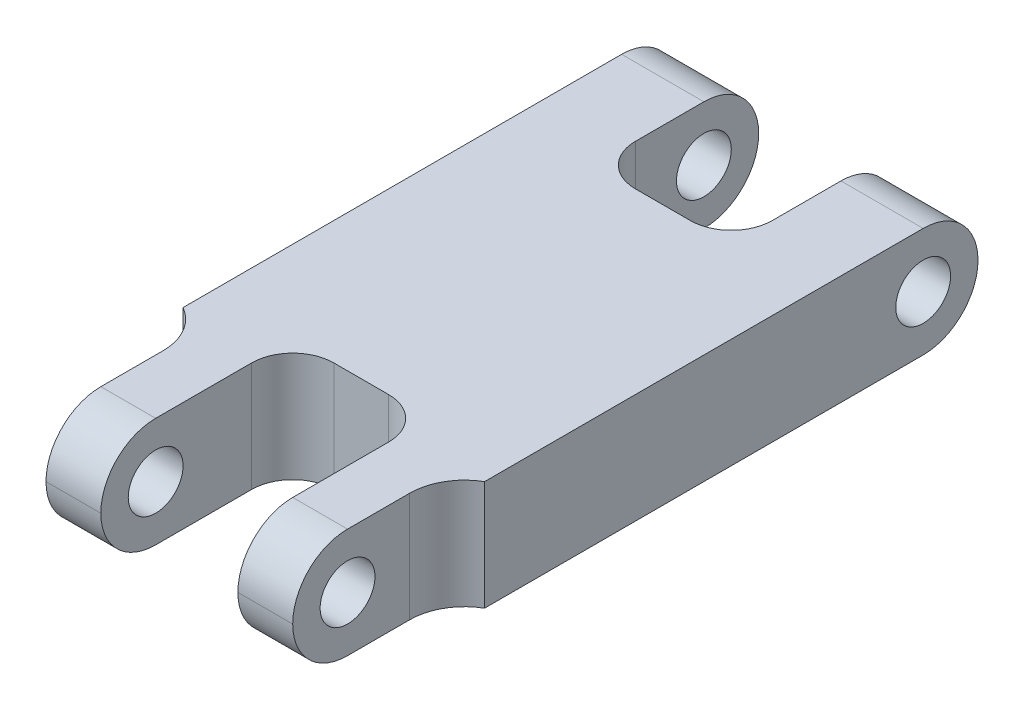
ISO-10303-21;
HEADER;
FILE_DESCRIPTION(('STEP AP214'),'2;1');
FILE_NAME('part.step','',(''),(''),'','','');
FILE_SCHEMA(('AUTOMOTIVE_DESIGN { 1 0 10303 214 1 1 1 1 }'));
ENDSEC;
DATA;
#1=APPLICATION_CONTEXT('core data for automotive mechanical design processes');
#2=APPLICATION_PROTOCOL_DEFINITION('international standard','automotive_design',2000,#1);
#3=PRODUCT_CONTEXT('',#1,'mechanical');
#4=PRODUCT('Part','Part','',(#3));
#5=PRODUCT_RELATED_PRODUCT_CATEGORY('part','',(#4));
#6=PRODUCT_DEFINITION_FORMATION('','',#4);
#7=PRODUCT_DEFINITION_CONTEXT('part definition',#1,'design');
#8=PRODUCT_DEFINITION('design','',#6,#7);
#9=PRODUCT_DEFINITION_SHAPE('','',#8);
#10=(LENGTH_UNIT() NAMED_UNIT(*) SI_UNIT(.MILLI.,.METRE.));
#11=(NAMED_UNIT(*) PLANE_ANGLE_UNIT() SI_UNIT($,.RADIAN.));
#12=(NAMED_UNIT(*) SI_UNIT($,.STERADIAN.) SOLID_ANGLE_UNIT());
#13=UNCERTAINTY_MEASURE_WITH_UNIT(LENGTH_MEASURE(1.E-05),#10,'distance_accuracy_value','');
#14=(GEOMETRIC_REPRESENTATION_CONTEXT(3) GLOBAL_UNCERTAINTY_ASSIGNED_CONTEXT((#13)) GLOBAL_UNIT_ASSIGNED_CONTEXT((#10,
#11,#12)) REPRESENTATION_CONTEXT('',''));
#15=CARTESIAN_POINT('',(0.,0.,0.));
#16=DIRECTION('',(0.,0.,1.));
#17=DIRECTION('',(1.,0.,0.));
#18=AXIS2_PLACEMENT_3D('',#15,#16,#17);
#19=CARTESIAN_POINT('',(-17.4625,6.35,76.2));
#20=DIRECTION('',(1.,0.,0.));
#21=DIRECTION('',(0.,1.,0.));
#22=AXIS2_PLACEMENT_3D('',#19,#20,#21);
#23=PLANE('',#22);
#24=CARTESIAN_POINT('',(-17.4625,0.,6.35));
#25=DIRECTION('',(1.,0.,0.));
#26=DIRECTION('',(0.,0.,-1.));
#27=AXIS2_PLACEMENT_3D('',#24,#25,#26);
#28=CIRCLE('',#27,3.175);
#29=CARTESIAN_POINT('',(-17.4625,0.,3.175));
#30=VERTEX_POINT('',#29);
#31=EDGE_CURVE('E249',#30,#30,#28,.T.);
#32=ORIENTED_EDGE('',*,*,#31,.T.);
#33=EDGE_LOOP('',(#32));
#34=FACE_BOUND('',#33,.T.);
#35=DIRECTION('',(0.,0.,-1.));
#36=VECTOR('',#35,1.);
#37=CARTESIAN_POINT('',(-17.4625,-6.35,76.2));
#38=LINE('',#37,#36);
#39=CARTESIAN_POINT('',(-17.4625,-6.35,57.15));
#40=VERTEX_POINT('',#39);
#41=CARTESIAN_POINT('',(-17.4625,-6.35,6.35000000000002));
#42=VERTEX_POINT('',#41);
#43=EDGE_CURVE('E201',#40,#42,#38,.T.);
#44=ORIENTED_EDGE('',*,*,#43,.F.);
#45=DIRECTION('',(0.,1.,0.));
#46=VECTOR('',#45,1.);
#47=CARTESIAN_POINT('',(-17.4625,-6.35,57.15));
#48=LINE('',#47,#46);
#49=CARTESIAN_POINT('',(-17.4625,6.35,57.15));
#50=VERTEX_POINT('',#49);
#51=EDGE_CURVE('E211',#40,#50,#48,.T.);
#52=ORIENTED_EDGE('',*,*,#51,.T.);
#53=DIRECTION('',(0.,0.,-1.));
#54=VECTOR('',#53,1.);
#55=CARTESIAN_POINT('',(-17.4625,6.35,76.2));
#56=LINE('',#55,#54);
#57=CARTESIAN_POINT('',(-17.4625,6.35,6.35000000000002));
#58=VERTEX_POINT('',#57);
#59=EDGE_CURVE('E286',#50,#58,#56,.T.);
#60=ORIENTED_EDGE('',*,*,#59,.T.);
#61=CARTESIAN_POINT('',(-17.4625,0.,6.34999999999999));
#62=DIRECTION('',(1.,0.,0.));
#63=DIRECTION('',(0.,1.,0.));
#64=AXIS2_PLACEMENT_3D('',#61,#62,#63);
#65=CIRCLE('',#64,6.35);
#66=CARTESIAN_POINT('',(-17.4625,0.,0.));
#67=VERTEX_POINT('',#66);
#68=EDGE_CURVE('E333',#58,#67,#65,.F.);
#69=ORIENTED_EDGE('',*,*,#68,.T.);
#70=CARTESIAN_POINT('',(-17.4625,0.,6.34999999999999));
#71=DIRECTION('',(1.,0.,0.));
#72=DIRECTION('',(0.,1.,0.));
#73=AXIS2_PLACEMENT_3D('',#70,#71,#72);
#74=CIRCLE('',#73,6.35);
#75=EDGE_CURVE('E214',#67,#42,#74,.F.);
#76=ORIENTED_EDGE('',*,*,#75,.T.);
#77=EDGE_LOOP('',(#44,#52,#60,#69,#76));
#78=FACE_BOUND('',#77,.T.);
#79=ADVANCED_FACE('F38',(#34,#78),#23,.F.);
#80=CARTESIAN_POINT('',(-17.4625,-6.35,76.2));
#81=DIRECTION('',(0.,1.,0.));
#82=DIRECTION('',(0.,0.,1.));
#83=AXIS2_PLACEMENT_3D('',#80,#81,#82);
#84=PLANE('',#83);
#85=DIRECTION('',(1.,0.,0.));
#86=VECTOR('',#85,1.);
#87=CARTESIAN_POINT('',(-17.4625,-6.35,69.85));
#88=LINE('',#87,#86);
#89=CARTESIAN_POINT('',(-7.9375,-6.35,69.85));
#90=VERTEX_POINT('',#89);
#91=CARTESIAN_POINT('',(-14.2875,-6.35,69.85));
#92=VERTEX_POINT('',#91);
#93=EDGE_CURVE('E307',#90,#92,#88,.F.);
#94=ORIENTED_EDGE('',*,*,#93,.T.);
#95=DIRECTION('',(0.,0.,-1.));
#96=VECTOR('',#95,1.);
#97=CARTESIAN_POINT('',(-14.2875,-6.35,57.15));
#98=LINE('',#97,#96);
#99=CARTESIAN_POINT('',(-14.2875,-6.35,62.6492613140312));
#100=VERTEX_POINT('',#99);
#101=EDGE_CURVE('E203',#92,#100,#98,.T.);
#102=ORIENTED_EDGE('',*,*,#101,.T.);
#103=CARTESIAN_POINT('',(-20.6375,-6.35,62.6492613140312));
#104=DIRECTION('',(0.,1.,0.));
#105=DIRECTION('',(0.,0.,1.));
#106=AXIS2_PLACEMENT_3D('',#103,#104,#105);
#107=CIRCLE('',#106,6.35);
#108=EDGE_CURVE('E197',#100,#40,#107,.T.);
#109=ORIENTED_EDGE('',*,*,#108,.T.);
#110=ORIENTED_EDGE('',*,*,#43,.T.);
#111=DIRECTION('',(1.,0.,0.));
#112=VECTOR('',#111,1.);
#113=CARTESIAN_POINT('',(-17.4625,-6.35,6.34999999999999));
#114=LINE('',#113,#112);
#115=CARTESIAN_POINT('',(-7.9375,-6.35,6.34999999999999));
#116=VERTEX_POINT('',#115);
#117=EDGE_CURVE('E302',#42,#116,#114,.T.);
#118=ORIENTED_EDGE('',*,*,#117,.T.);
#119=DIRECTION('',(0.,0.,1.));
#120=VECTOR('',#119,1.);
#121=CARTESIAN_POINT('',(-7.9375,-6.35,0.));
#122=LINE('',#121,#120);
#123=CARTESIAN_POINT('',(-7.9375,-6.35,14.2875));
#124=VERTEX_POINT('',#123);
#125=EDGE_CURVE('E259',#116,#124,#122,.T.);
#126=ORIENTED_EDGE('',*,*,#125,.T.);
#127=CARTESIAN_POINT('',(-3.175,-6.35,14.2875));
#128=DIRECTION('',(0.,1.,0.));
#129=DIRECTION('',(0.,0.,1.));
#130=AXIS2_PLACEMENT_3D('',#127,#128,#129);
#131=CIRCLE('',#130,4.7625);
#132=CARTESIAN_POINT('',(-3.175,-6.35,19.05));
#133=VERTEX_POINT('',#132);
#134=EDGE_CURVE('E369',#124,#133,#131,.T.);
#135=ORIENTED_EDGE('',*,*,#134,.T.);
#136=DIRECTION('',(1.,0.,0.));
#137=VECTOR('',#136,1.);
#138=CARTESIAN_POINT('',(-7.9375,-6.35,19.05));
#139=LINE('',#138,#137);
#140=CARTESIAN_POINT('',(3.175,-6.35,19.05));
#141=VERTEX_POINT('',#140);
#142=EDGE_CURVE('E262',#133,#141,#139,.T.);
#143=ORIENTED_EDGE('',*,*,#142,.T.);
#144=CARTESIAN_POINT('',(3.175,-6.35,14.2875));
#145=DIRECTION('',(0.,1.,0.));
#146=DIRECTION('',(0.,0.,1.));
#147=AXIS2_PLACEMENT_3D('',#144,#145,#146);
#148=CIRCLE('',#147,4.7625);
#149=CARTESIAN_POINT('',(7.9375,-6.35,14.2875));
#150=VERTEX_POINT('',#149);
#151=EDGE_CURVE('E373',#141,#150,#148,.T.);
#152=ORIENTED_EDGE('',*,*,#151,.T.);
#153=DIRECTION('',(0.,0.,-1.));
#154=VECTOR('',#153,1.);
#155=CARTESIAN_POINT('',(7.9375,-6.35,0.));
#156=LINE('',#155,#154);
#157=CARTESIAN_POINT('',(7.9375,-6.35,6.34999999999999));
#158=VERTEX_POINT('',#157);
#159=EDGE_CURVE('E266',#150,#158,#156,.T.);
#160=ORIENTED_EDGE('',*,*,#159,.T.);
#161=DIRECTION('',(1.,0.,0.));
#162=VECTOR('',#161,1.);
#163=CARTESIAN_POINT('',(-17.4625,-6.35,6.34999999999999));
#164=LINE('',#163,#162);
#165=CARTESIAN_POINT('',(17.4625,-6.35,6.35000000000002));
#166=VERTEX_POINT('',#165);
#167=EDGE_CURVE('E304',#158,#166,#164,.T.);
#168=ORIENTED_EDGE('',*,*,#167,.T.);
#169=DIRECTION('',(0.,0.,-1.));
#170=VECTOR('',#169,1.);
#171=CARTESIAN_POINT('',(17.4625,-6.35,76.2));
#172=LINE('',#171,#170);
#173=CARTESIAN_POINT('',(17.4625,-6.35,57.15));
#174=VERTEX_POINT('',#173);
#175=EDGE_CURVE('E217',#174,#166,#172,.T.);
#176=ORIENTED_EDGE('',*,*,#175,.F.);
#177=CARTESIAN_POINT('',(20.6375,-6.35,62.6492613140312));
#178=DIRECTION('',(0.,1.,0.));
#179=DIRECTION('',(0.,0.,1.));
#180=AXIS2_PLACEMENT_3D('',#177,#178,#179);
#181=CIRCLE('',#180,6.35);
#182=CARTESIAN_POINT('',(14.2875,-6.35,62.6492613140312));
#183=VERTEX_POINT('',#182);
#184=EDGE_CURVE('E11',#174,#183,#181,.T.);
#185=ORIENTED_EDGE('',*,*,#184,.T.);
#186=DIRECTION('',(0.,0.,1.));
#187=VECTOR('',#186,1.);
#188=CARTESIAN_POINT('',(14.2875,-6.35,57.15));
#189=LINE('',#188,#187);
#190=CARTESIAN_POINT('',(14.2875,-6.35,69.85));
#191=VERTEX_POINT('',#190);
#192=EDGE_CURVE('E233',#183,#191,#189,.T.);
#193=ORIENTED_EDGE('',*,*,#192,.T.);
#194=DIRECTION('',(1.,0.,0.));
#195=VECTOR('',#194,1.);
#196=CARTESIAN_POINT('',(7.9375,-6.35,69.85));
#197=LINE('',#196,#195);
#198=CARTESIAN_POINT('',(7.9375,-6.35,69.85));
#199=VERTEX_POINT('',#198);
#200=EDGE_CURVE('E309',#191,#199,#197,.F.);
#201=ORIENTED_EDGE('',*,*,#200,.T.);
#202=DIRECTION('',(0.,0.,-1.));
#203=VECTOR('',#202,1.);
#204=CARTESIAN_POINT('',(7.9375,-6.35,53.975));
#205=LINE('',#204,#203);
#206=CARTESIAN_POINT('',(7.9375,-6.35,58.7375));
#207=VERTEX_POINT('',#206);
#208=EDGE_CURVE('E279',#199,#207,#205,.T.);
#209=ORIENTED_EDGE('',*,*,#208,.T.);
#210=CARTESIAN_POINT('',(3.175,-6.35,58.7375));
#211=DIRECTION('',(0.,1.,0.));
#212=DIRECTION('',(0.,0.,1.));
#213=AXIS2_PLACEMENT_3D('',#210,#211,#212);
#214=CIRCLE('',#213,4.7625);
#215=CARTESIAN_POINT('',(3.175,-6.35,53.975));
#216=VERTEX_POINT('',#215);
#217=EDGE_CURVE('E387',#207,#216,#214,.T.);
#218=ORIENTED_EDGE('',*,*,#217,.T.);
#219=DIRECTION('',(-1.,0.,0.));
#220=VECTOR('',#219,1.);
#221=CARTESIAN_POINT('',(-7.9375,-6.35,53.975));
#222=LINE('',#221,#220);
#223=CARTESIAN_POINT('',(-3.175,-6.35,53.975));
#224=VERTEX_POINT('',#223);
#225=EDGE_CURVE('E283',#216,#224,#222,.T.);
#226=ORIENTED_EDGE('',*,*,#225,.T.);
#227=CARTESIAN_POINT('',(-3.175,-6.35,58.7375));
#228=DIRECTION('',(0.,1.,0.));
#229=DIRECTION('',(0.,0.,1.));
#230=AXIS2_PLACEMENT_3D('',#227,#228,#229);
#231=CIRCLE('',#230,4.7625);
#232=CARTESIAN_POINT('',(-7.9375,-6.35,58.7375));
#233=VERTEX_POINT('',#232);
#234=EDGE_CURVE('E391',#224,#233,#231,.T.);
#235=ORIENTED_EDGE('',*,*,#234,.T.);
#236=DIRECTION('',(0.,0.,1.));
#237=VECTOR('',#236,1.);
#238=CARTESIAN_POINT('',(-7.9375,-6.35,53.975));
#239=LINE('',#238,#237);
#240=EDGE_CURVE('E277',#233,#90,#239,.T.);
#241=ORIENTED_EDGE('',*,*,#240,.T.);
#242=EDGE_LOOP('',(#94,#102,#109,#110,#118,#126,#135,#143,#152,#160,#168,#176,#185,#193,#201,
#209,#218,#226,#235,#241));
#243=FACE_BOUND('',#242,.T.);
#244=ADVANCED_FACE('F200',(#243),#84,.F.);
#245=CARTESIAN_POINT('',(17.4625,6.35,76.2));
#246=DIRECTION('',(-1.,0.,0.));
#247=DIRECTION('',(0.,0.,1.));
#248=AXIS2_PLACEMENT_3D('',#245,#246,#247);
#249=PLANE('',#248);
#250=CARTESIAN_POINT('',(17.4625,0.,6.35));
#251=DIRECTION('',(1.,0.,0.));
#252=DIRECTION('',(0.,0.,-1.));
#253=AXIS2_PLACEMENT_3D('',#250,#251,#252);
#254=CIRCLE('',#253,3.175);
#255=CARTESIAN_POINT('',(17.4625,0.,3.175));
#256=VERTEX_POINT('',#255);
#257=EDGE_CURVE('E248',#256,#256,#254,.T.);
#258=ORIENTED_EDGE('',*,*,#257,.F.);
#259=EDGE_LOOP('',(#258));
#260=FACE_BOUND('',#259,.T.);
#261=DIRECTION('',(0.,0.,-1.));
#262=VECTOR('',#261,1.);
#263=CARTESIAN_POINT('',(17.4625,6.35,76.2));
#264=LINE('',#263,#262);
#265=CARTESIAN_POINT('',(17.4625,6.35,57.15));
#266=VERTEX_POINT('',#265);
#267=CARTESIAN_POINT('',(17.4625,6.35,6.35000000000002));
#268=VERTEX_POINT('',#267);
#269=EDGE_CURVE('E295',#266,#268,#264,.T.);
#270=ORIENTED_EDGE('',*,*,#269,.F.);
#271=DIRECTION('',(0.,1.,0.));
#272=VECTOR('',#271,1.);
#273=CARTESIAN_POINT('',(17.4625,-6.35,57.15));
#274=LINE('',#273,#272);
#275=EDGE_CURVE('E235',#174,#266,#274,.T.);
#276=ORIENTED_EDGE('',*,*,#275,.F.);
#277=ORIENTED_EDGE('',*,*,#175,.T.);
#278=CARTESIAN_POINT('',(17.4625,0.,6.34999999999999));
#279=DIRECTION('',(-1.,0.,0.));
#280=DIRECTION('',(0.,0.,1.));
#281=AXIS2_PLACEMENT_3D('',#278,#279,#280);
#282=CIRCLE('',#281,6.35);
#283=CARTESIAN_POINT('',(17.4625,0.,0.));
#284=VERTEX_POINT('',#283);
#285=EDGE_CURVE('E300',#166,#284,#282,.F.);
#286=ORIENTED_EDGE('',*,*,#285,.T.);
#287=CARTESIAN_POINT('',(17.4625,0.,6.34999999999999));
#288=DIRECTION('',(-1.,0.,0.));
#289=DIRECTION('',(0.,0.,1.));
#290=AXIS2_PLACEMENT_3D('',#287,#288,#289);
#291=CIRCLE('',#290,6.35);
#292=EDGE_CURVE('E216',#284,#268,#291,.F.);
#293=ORIENTED_EDGE('',*,*,#292,.T.);
#294=EDGE_LOOP('',(#270,#276,#277,#286,#293));
#295=FACE_BOUND('',#294,.T.);
#296=ADVANCED_FACE('F404',(#260,#295),#249,.F.);
#297=CARTESIAN_POINT('',(-17.4625,6.35,76.2));
#298=DIRECTION('',(0.,-1.,0.));
#299=DIRECTION('',(0.,0.,-1.));
#300=AXIS2_PLACEMENT_3D('',#297,#298,#299);
#301=PLANE('',#300);
#302=ORIENTED_EDGE('',*,*,#59,.F.);
#303=CARTESIAN_POINT('',(-20.6375,6.35,62.6492613140312));
#304=DIRECTION('',(0.,-1.,0.));
#305=DIRECTION('',(0.,0.,-1.));
#306=AXIS2_PLACEMENT_3D('',#303,#304,#305);
#307=CIRCLE('',#306,6.35);
#308=CARTESIAN_POINT('',(-14.2875,6.35,62.6492613140312));
#309=VERTEX_POINT('',#308);
#310=EDGE_CURVE('E207',#50,#309,#307,.T.);
#311=ORIENTED_EDGE('',*,*,#310,.T.);
#312=DIRECTION('',(0.,0.,-1.));
#313=VECTOR('',#312,1.);
#314=CARTESIAN_POINT('',(-14.2875,6.35,57.15));
#315=LINE('',#314,#313);
#316=CARTESIAN_POINT('',(-14.2875,6.35,69.85));
#317=VERTEX_POINT('',#316);
#318=EDGE_CURVE('E225',#317,#309,#315,.T.);
#319=ORIENTED_EDGE('',*,*,#318,.F.);
#320=DIRECTION('',(-1.,0.,0.));
#321=VECTOR('',#320,1.);
#322=CARTESIAN_POINT('',(-7.93750000000001,6.35,69.85));
#323=LINE('',#322,#321);
#324=CARTESIAN_POINT('',(-7.9375,6.35,69.85));
#325=VERTEX_POINT('',#324);
#326=EDGE_CURVE('E322',#317,#325,#323,.F.);
#327=ORIENTED_EDGE('',*,*,#326,.T.);
#328=DIRECTION('',(0.,0.,1.));
#329=VECTOR('',#328,1.);
#330=CARTESIAN_POINT('',(-7.9375,6.35,53.975));
#331=LINE('',#330,#329);
#332=CARTESIAN_POINT('',(-7.9375,6.35,58.7375));
#333=VERTEX_POINT('',#332);
#334=EDGE_CURVE('E268',#333,#325,#331,.T.);
#335=ORIENTED_EDGE('',*,*,#334,.F.);
#336=CARTESIAN_POINT('',(-3.175,6.35,58.7375));
#337=DIRECTION('',(0.,-1.,0.));
#338=DIRECTION('',(0.,0.,-1.));
#339=AXIS2_PLACEMENT_3D('',#336,#337,#338);
#340=CIRCLE('',#339,4.7625);
#341=CARTESIAN_POINT('',(-3.175,6.35,53.975));
#342=VERTEX_POINT('',#341);
#343=EDGE_CURVE('E389',#333,#342,#340,.T.);
#344=ORIENTED_EDGE('',*,*,#343,.T.);
#345=DIRECTION('',(-1.,0.,0.));
#346=VECTOR('',#345,1.);
#347=CARTESIAN_POINT('',(-7.9375,6.35,53.975));
#348=LINE('',#347,#346);
#349=CARTESIAN_POINT('',(3.175,6.35,53.975));
#350=VERTEX_POINT('',#349);
#351=EDGE_CURVE('E280',#350,#342,#348,.T.);
#352=ORIENTED_EDGE('',*,*,#351,.F.);
#353=CARTESIAN_POINT('',(3.175,6.35,58.7375));
#354=DIRECTION('',(0.,-1.,0.));
#355=DIRECTION('',(0.,0.,-1.));
#356=AXIS2_PLACEMENT_3D('',#353,#354,#355);
#357=CIRCLE('',#356,4.7625);
#358=CARTESIAN_POINT('',(7.9375,6.35,58.7375));
#359=VERTEX_POINT('',#358);
#360=EDGE_CURVE('E385',#350,#359,#357,.T.);
#361=ORIENTED_EDGE('',*,*,#360,.T.);
#362=DIRECTION('',(0.,0.,-1.));
#363=VECTOR('',#362,1.);
#364=CARTESIAN_POINT('',(7.9375,6.35,53.975));
#365=LINE('',#364,#363);
#366=CARTESIAN_POINT('',(7.9375,6.35,69.85));
#367=VERTEX_POINT('',#366);
#368=EDGE_CURVE('E289',#367,#359,#365,.T.);
#369=ORIENTED_EDGE('',*,*,#368,.F.);
#370=DIRECTION('',(-1.,0.,0.));
#371=VECTOR('',#370,1.);
#372=CARTESIAN_POINT('',(17.4625,6.35,69.85));
#373=LINE('',#372,#371);
#374=CARTESIAN_POINT('',(14.2875,6.35,69.85));
#375=VERTEX_POINT('',#374);
#376=EDGE_CURVE('E324',#367,#375,#373,.F.);
#377=ORIENTED_EDGE('',*,*,#376,.T.);
#378=DIRECTION('',(0.,0.,1.));
#379=VECTOR('',#378,1.);
#380=CARTESIAN_POINT('',(14.2875,6.35,57.15));
#381=LINE('',#380,#379);
#382=CARTESIAN_POINT('',(14.2875,6.35,62.6492613140312));
#383=VERTEX_POINT('',#382);
#384=EDGE_CURVE('E232',#383,#375,#381,.T.);
#385=ORIENTED_EDGE('',*,*,#384,.F.);
#386=CARTESIAN_POINT('',(20.6375,6.35,62.6492613140312));
#387=DIRECTION('',(0.,-1.,0.));
#388=DIRECTION('',(0.,0.,-1.));
#389=AXIS2_PLACEMENT_3D('',#386,#387,#388);
#390=CIRCLE('',#389,6.35);
#391=EDGE_CURVE('E46',#383,#266,#390,.T.);
#392=ORIENTED_EDGE('',*,*,#391,.T.);
#393=ORIENTED_EDGE('',*,*,#269,.T.);
#394=DIRECTION('',(-1.,0.,0.));
#395=VECTOR('',#394,1.);
#396=CARTESIAN_POINT('',(-17.4625,6.35,6.34999999999999));
#397=LINE('',#396,#395);
#398=CARTESIAN_POINT('',(7.9375,6.35,6.34999999999999));
#399=VERTEX_POINT('',#398);
#400=EDGE_CURVE('E316',#268,#399,#397,.T.);
#401=ORIENTED_EDGE('',*,*,#400,.T.);
#402=DIRECTION('',(0.,0.,-1.));
#403=VECTOR('',#402,1.);
#404=CARTESIAN_POINT('',(7.9375,6.35,0.));
#405=LINE('',#404,#403);
#406=CARTESIAN_POINT('',(7.9375,6.35,14.2875));
#407=VERTEX_POINT('',#406);
#408=EDGE_CURVE('E263',#407,#399,#405,.T.);
#409=ORIENTED_EDGE('',*,*,#408,.F.);
#410=CARTESIAN_POINT('',(3.175,6.35,14.2875));
#411=DIRECTION('',(0.,-1.,0.));
#412=DIRECTION('',(0.,0.,-1.));
#413=AXIS2_PLACEMENT_3D('',#410,#411,#412);
#414=CIRCLE('',#413,4.7625);
#415=CARTESIAN_POINT('',(3.175,6.35,19.05));
#416=VERTEX_POINT('',#415);
#417=EDGE_CURVE('E371',#407,#416,#414,.T.);
#418=ORIENTED_EDGE('',*,*,#417,.T.);
#419=DIRECTION('',(1.,0.,0.));
#420=VECTOR('',#419,1.);
#421=CARTESIAN_POINT('',(-7.9375,6.35,19.05));
#422=LINE('',#421,#420);
#423=CARTESIAN_POINT('',(-3.175,6.35,19.05));
#424=VERTEX_POINT('',#423);
#425=EDGE_CURVE('E272',#424,#416,#422,.T.);
#426=ORIENTED_EDGE('',*,*,#425,.F.);
#427=CARTESIAN_POINT('',(-3.175,6.35,14.2875));
#428=DIRECTION('',(0.,-1.,0.));
#429=DIRECTION('',(0.,0.,-1.));
#430=AXIS2_PLACEMENT_3D('',#427,#428,#429);
#431=CIRCLE('',#430,4.7625);
#432=CARTESIAN_POINT('',(-7.9375,6.35,14.2875));
#433=VERTEX_POINT('',#432);
#434=EDGE_CURVE('E367',#424,#433,#431,.T.);
#435=ORIENTED_EDGE('',*,*,#434,.T.);
#436=DIRECTION('',(0.,0.,1.));
#437=VECTOR('',#436,1.);
#438=CARTESIAN_POINT('',(-7.9375,6.35,0.));
#439=LINE('',#438,#437);
#440=CARTESIAN_POINT('',(-7.9375,6.35,6.34999999999999));
#441=VERTEX_POINT('',#440);
#442=EDGE_CURVE('E269',#441,#433,#439,.T.);
#443=ORIENTED_EDGE('',*,*,#442,.F.);
#444=DIRECTION('',(-1.,0.,0.));
#445=VECTOR('',#444,1.);
#446=CARTESIAN_POINT('',(-17.4625,6.35,6.34999999999999));
#447=LINE('',#446,#445);
#448=EDGE_CURVE('E319',#441,#58,#447,.T.);
#449=ORIENTED_EDGE('',*,*,#448,.T.);
#450=EDGE_LOOP('',(#302,#311,#319,#327,#335,#344,#352,#361,#369,#377,#385,#392,#393,#401,#409,
#418,#426,#435,#443,#449));
#451=FACE_BOUND('',#450,.T.);
#452=ADVANCED_FACE('F402',(#451),#301,.F.);
#453=CARTESIAN_POINT('',(-7.9375,-6.35,53.975));
#454=DIRECTION('',(-1.,0.,0.));
#455=DIRECTION('',(0.,0.,1.));
#456=AXIS2_PLACEMENT_3D('',#453,#454,#455);
#457=PLANE('',#456);
#458=CARTESIAN_POINT('',(-7.9375,0.,69.85));
#459=DIRECTION('',(-1.,0.,0.));
#460=DIRECTION('',(0.,0.,1.));
#461=AXIS2_PLACEMENT_3D('',#458,#459,#460);
#462=CIRCLE('',#461,3.175);
#463=CARTESIAN_POINT('',(-7.9375,0.,73.025));
#464=VERTEX_POINT('',#463);
#465=EDGE_CURVE('E245',#464,#464,#462,.T.);
#466=ORIENTED_EDGE('',*,*,#465,.T.);
#467=EDGE_LOOP('',(#466));
#468=FACE_BOUND('',#467,.T.);
#469=ORIENTED_EDGE('',*,*,#240,.F.);
#470=DIRECTION('',(0.,1.,0.));
#471=VECTOR('',#470,1.);
#472=CARTESIAN_POINT('',(-7.9375,6.35,58.7375));
#473=LINE('',#472,#471);
#474=EDGE_CURVE('E382',#233,#333,#473,.T.);
#475=ORIENTED_EDGE('',*,*,#474,.T.);
#476=ORIENTED_EDGE('',*,*,#334,.T.);
#477=CARTESIAN_POINT('',(-7.9375,0.,69.85));
#478=DIRECTION('',(-1.,0.,0.));
#479=DIRECTION('',(0.,0.,1.));
#480=AXIS2_PLACEMENT_3D('',#477,#478,#479);
#481=CIRCLE('',#480,6.35);
#482=CARTESIAN_POINT('',(-7.93750000000001,0.,76.2));
#483=VERTEX_POINT('',#482);
#484=EDGE_CURVE('E327',#325,#483,#481,.F.);
#485=ORIENTED_EDGE('',*,*,#484,.T.);
#486=CARTESIAN_POINT('',(-7.9375,0.,69.85));
#487=DIRECTION('',(-1.,0.,0.));
#488=DIRECTION('',(0.,0.,1.));
#489=AXIS2_PLACEMENT_3D('',#486,#487,#488);
#490=CIRCLE('',#489,6.35);
#491=EDGE_CURVE('E329',#483,#90,#490,.F.);
#492=ORIENTED_EDGE('',*,*,#491,.T.);
#493=EDGE_LOOP('',(#469,#475,#476,#485,#492));
#494=FACE_BOUND('',#493,.T.);
#495=ADVANCED_FACE('F438',(#468,#494),#457,.F.);
#496=CARTESIAN_POINT('',(-7.9375,-6.35,53.975));
#497=DIRECTION('',(0.,0.,-1.));
#498=DIRECTION('',(-1.,0.,0.));
#499=AXIS2_PLACEMENT_3D('',#496,#497,#498);
#500=PLANE('',#499);
#501=ORIENTED_EDGE('',*,*,#225,.F.);
#502=DIRECTION('',(0.,1.,0.));
#503=VECTOR('',#502,1.);
#504=CARTESIAN_POINT('',(3.175,6.35,53.975));
#505=LINE('',#504,#503);
#506=EDGE_CURVE('E377',#216,#350,#505,.T.);
#507=ORIENTED_EDGE('',*,*,#506,.T.);
#508=ORIENTED_EDGE('',*,*,#351,.T.);
#509=DIRECTION('',(0.,1.,0.));
#510=VECTOR('',#509,1.);
#511=CARTESIAN_POINT('',(-3.175,-6.35,53.975));
#512=LINE('',#511,#510);
#513=EDGE_CURVE('E375',#342,#224,#512,.F.);
#514=ORIENTED_EDGE('',*,*,#513,.T.);
#515=EDGE_LOOP('',(#501,#507,#508,#514));
#516=FACE_BOUND('',#515,.T.);
#517=ADVANCED_FACE('F430',(#516),#500,.F.);
#518=CARTESIAN_POINT('',(7.9375,-6.35,53.975));
#519=DIRECTION('',(1.,0.,0.));
#520=DIRECTION('',(0.,0.,-1.));
#521=AXIS2_PLACEMENT_3D('',#518,#519,#520);
#522=PLANE('',#521);
#523=CARTESIAN_POINT('',(7.9375,0.,69.85));
#524=DIRECTION('',(1.,0.,0.));
#525=DIRECTION('',(0.,0.,-1.));
#526=AXIS2_PLACEMENT_3D('',#523,#524,#525);
#527=CIRCLE('',#526,3.175);
#528=CARTESIAN_POINT('',(7.9375,0.,66.675));
#529=VERTEX_POINT('',#528);
#530=EDGE_CURVE('E244',#529,#529,#527,.T.);
#531=ORIENTED_EDGE('',*,*,#530,.T.);
#532=EDGE_LOOP('',(#531));
#533=FACE_BOUND('',#532,.T.);
#534=ORIENTED_EDGE('',*,*,#368,.T.);
#535=DIRECTION('',(0.,1.,0.));
#536=VECTOR('',#535,1.);
#537=CARTESIAN_POINT('',(7.9375,-6.35,58.7375));
#538=LINE('',#537,#536);
#539=EDGE_CURVE('E380',#359,#207,#538,.F.);
#540=ORIENTED_EDGE('',*,*,#539,.T.);
#541=ORIENTED_EDGE('',*,*,#208,.F.);
#542=CARTESIAN_POINT('',(7.9375,0.,69.85));
#543=DIRECTION('',(1.,0.,0.));
#544=DIRECTION('',(0.,0.,-1.));
#545=AXIS2_PLACEMENT_3D('',#542,#543,#544);
#546=CIRCLE('',#545,6.35);
#547=CARTESIAN_POINT('',(7.93750000000001,0.,76.2));
#548=VERTEX_POINT('',#547);
#549=EDGE_CURVE('E313',#199,#548,#546,.F.);
#550=ORIENTED_EDGE('',*,*,#549,.T.);
#551=CARTESIAN_POINT('',(7.9375,0.,69.85));
#552=DIRECTION('',(1.,0.,0.));
#553=DIRECTION('',(0.,0.,-1.));
#554=AXIS2_PLACEMENT_3D('',#551,#552,#553);
#555=CIRCLE('',#554,6.35);
#556=EDGE_CURVE('E311',#548,#367,#555,.F.);
#557=ORIENTED_EDGE('',*,*,#556,.T.);
#558=EDGE_LOOP('',(#534,#540,#541,#550,#557));
#559=FACE_BOUND('',#558,.T.);
#560=ADVANCED_FACE('F421',(#533,#559),#522,.F.);
#561=CARTESIAN_POINT('',(-7.9375,-6.35,0.));
#562=DIRECTION('',(-1.,0.,0.));
#563=DIRECTION('',(0.,0.,1.));
#564=AXIS2_PLACEMENT_3D('',#561,#562,#563);
#565=PLANE('',#564);
#566=CARTESIAN_POINT('',(-7.9375,0.,6.35));
#567=DIRECTION('',(-1.,0.,0.));
#568=DIRECTION('',(0.,0.,1.));
#569=AXIS2_PLACEMENT_3D('',#566,#567,#568);
#570=CIRCLE('',#569,3.175);
#571=CARTESIAN_POINT('',(-7.9375,0.,9.525));
#572=VERTEX_POINT('',#571);
#573=EDGE_CURVE('E255',#572,#572,#570,.T.);
#574=ORIENTED_EDGE('',*,*,#573,.T.);
#575=EDGE_LOOP('',(#574));
#576=FACE_BOUND('',#575,.T.);
#577=ORIENTED_EDGE('',*,*,#442,.T.);
#578=DIRECTION('',(0.,1.,0.));
#579=VECTOR('',#578,1.);
#580=CARTESIAN_POINT('',(-7.9375,-6.35,14.2875));
#581=LINE('',#580,#579);
#582=EDGE_CURVE('E362',#433,#124,#581,.F.);
#583=ORIENTED_EDGE('',*,*,#582,.T.);
#584=ORIENTED_EDGE('',*,*,#125,.F.);
#585=CARTESIAN_POINT('',(-7.9375,0.,6.34999999999999));
#586=DIRECTION('',(-1.,0.,0.));
#587=DIRECTION('',(0.,0.,1.));
#588=AXIS2_PLACEMENT_3D('',#585,#586,#587);
#589=CIRCLE('',#588,6.35);
#590=CARTESIAN_POINT('',(-7.9375,0.,0.));
#591=VERTEX_POINT('',#590);
#592=EDGE_CURVE('E335',#116,#591,#589,.F.);
#593=ORIENTED_EDGE('',*,*,#592,.T.);
#594=CARTESIAN_POINT('',(-7.9375,0.,6.34999999999999));
#595=DIRECTION('',(-1.,0.,0.));
#596=DIRECTION('',(0.,0.,1.));
#597=AXIS2_PLACEMENT_3D('',#594,#595,#596);
#598=CIRCLE('',#597,6.35);
#599=EDGE_CURVE('E337',#591,#441,#598,.F.);
#600=ORIENTED_EDGE('',*,*,#599,.T.);
#601=EDGE_LOOP('',(#577,#583,#584,#593,#600));
#602=FACE_BOUND('',#601,.T.);
#603=ADVANCED_FACE('F469',(#576,#602),#565,.F.);
#604=CARTESIAN_POINT('',(7.9375,-6.35,0.));
#605=DIRECTION('',(1.,0.,0.));
#606=DIRECTION('',(0.,0.,-1.));
#607=AXIS2_PLACEMENT_3D('',#604,#605,#606);
#608=PLANE('',#607);
#609=CARTESIAN_POINT('',(7.9375,0.,6.35));
#610=DIRECTION('',(1.,0.,0.));
#611=DIRECTION('',(0.,0.,-1.));
#612=AXIS2_PLACEMENT_3D('',#609,#610,#611);
#613=CIRCLE('',#612,3.175);
#614=CARTESIAN_POINT('',(7.9375,0.,3.175));
#615=VERTEX_POINT('',#614);
#616=EDGE_CURVE('E252',#615,#615,#613,.T.);
#617=ORIENTED_EDGE('',*,*,#616,.T.);
#618=EDGE_LOOP('',(#617));
#619=FACE_BOUND('',#618,.T.);
#620=ORIENTED_EDGE('',*,*,#159,.F.);
#621=DIRECTION('',(0.,1.,0.));
#622=VECTOR('',#621,1.);
#623=CARTESIAN_POINT('',(7.9375,6.35,14.2875));
#624=LINE('',#623,#622);
#625=EDGE_CURVE('E364',#150,#407,#624,.T.);
#626=ORIENTED_EDGE('',*,*,#625,.T.);
#627=ORIENTED_EDGE('',*,*,#408,.T.);
#628=CARTESIAN_POINT('',(7.9375,0.,6.34999999999999));
#629=DIRECTION('',(1.,0.,0.));
#630=DIRECTION('',(0.,0.,-1.));
#631=AXIS2_PLACEMENT_3D('',#628,#629,#630);
#632=CIRCLE('',#631,6.35);
#633=CARTESIAN_POINT('',(7.9375,0.,0.));
#634=VERTEX_POINT('',#633);
#635=EDGE_CURVE('E339',#399,#634,#632,.F.);
#636=ORIENTED_EDGE('',*,*,#635,.T.);
#637=CARTESIAN_POINT('',(7.9375,0.,6.34999999999999));
#638=DIRECTION('',(1.,0.,0.));
#639=DIRECTION('',(0.,0.,-1.));
#640=AXIS2_PLACEMENT_3D('',#637,#638,#639);
#641=CIRCLE('',#640,6.35);
#642=EDGE_CURVE('E341',#634,#158,#641,.F.);
#643=ORIENTED_EDGE('',*,*,#642,.T.);
#644=EDGE_LOOP('',(#620,#626,#627,#636,#643));
#645=FACE_BOUND('',#644,.T.);
#646=ADVANCED_FACE('F485',(#619,#645),#608,.F.);
#647=CARTESIAN_POINT('',(-7.9375,-6.35,19.05));
#648=DIRECTION('',(0.,0.,1.));
#649=DIRECTION('',(1.,0.,0.));
#650=AXIS2_PLACEMENT_3D('',#647,#648,#649);
#651=PLANE('',#650);
#652=ORIENTED_EDGE('',*,*,#142,.F.);
#653=DIRECTION('',(0.,1.,0.));
#654=VECTOR('',#653,1.);
#655=CARTESIAN_POINT('',(-3.175,6.35,19.05));
#656=LINE('',#655,#654);
#657=EDGE_CURVE('E359',#133,#424,#656,.T.);
#658=ORIENTED_EDGE('',*,*,#657,.T.);
#659=ORIENTED_EDGE('',*,*,#425,.T.);
#660=DIRECTION('',(0.,1.,0.));
#661=VECTOR('',#660,1.);
#662=CARTESIAN_POINT('',(3.175,-6.35,19.05));
#663=LINE('',#662,#661);
#664=EDGE_CURVE('E344',#416,#141,#663,.F.);
#665=ORIENTED_EDGE('',*,*,#664,.T.);
#666=EDGE_LOOP('',(#652,#658,#659,#665));
#667=FACE_BOUND('',#666,.T.);
#668=ADVANCED_FACE('F477',(#667),#651,.F.);
#669=CARTESIAN_POINT('',(0.,0.,69.85));
#670=DIRECTION('',(1.,0.,0.));
#671=DIRECTION('',(0.,0.,-1.));
#672=AXIS2_PLACEMENT_3D('',#669,#670,#671);
#673=CYLINDRICAL_SURFACE('',#672,6.35);
#674=CARTESIAN_POINT('',(14.2875,0.,69.85));
#675=DIRECTION('',(-1.,0.,0.));
#676=DIRECTION('',(0.,0.,1.));
#677=AXIS2_PLACEMENT_3D('',#674,#675,#676);
#678=CIRCLE('',#677,6.35);
#679=CARTESIAN_POINT('',(14.2875,0.,76.2));
#680=VERTEX_POINT('',#679);
#681=EDGE_CURVE('E242',#375,#680,#678,.F.);
#682=ORIENTED_EDGE('',*,*,#681,.F.);
#683=ORIENTED_EDGE('',*,*,#376,.F.);
#684=ORIENTED_EDGE('',*,*,#556,.F.);
#685=DIRECTION('',(-1.,0.,0.));
#686=VECTOR('',#685,1.);
#687=CARTESIAN_POINT('',(7.93750000000001,0.,76.2));
#688=LINE('',#687,#686);
#689=EDGE_CURVE('E273',#680,#548,#688,.T.);
#690=ORIENTED_EDGE('',*,*,#689,.F.);
#691=EDGE_LOOP('',(#682,#683,#684,#690));
#692=FACE_BOUND('',#691,.T.);
#693=ADVANCED_FACE('F517',(#692),#673,.T.);
#694=CARTESIAN_POINT('',(0.,0.,69.85));
#695=DIRECTION('',(-1.,0.,0.));
#696=DIRECTION('',(0.,0.,1.));
#697=AXIS2_PLACEMENT_3D('',#694,#695,#696);
#698=CYLINDRICAL_SURFACE('',#697,6.35);
#699=CARTESIAN_POINT('',(14.2875,0.,69.85));
#700=DIRECTION('',(-1.,0.,0.));
#701=DIRECTION('',(0.,0.,1.));
#702=AXIS2_PLACEMENT_3D('',#699,#700,#701);
#703=CIRCLE('',#702,6.35);
#704=EDGE_CURVE('E239',#680,#191,#703,.F.);
#705=ORIENTED_EDGE('',*,*,#704,.F.);
#706=ORIENTED_EDGE('',*,*,#689,.T.);
#707=ORIENTED_EDGE('',*,*,#549,.F.);
#708=ORIENTED_EDGE('',*,*,#200,.F.);
#709=EDGE_LOOP('',(#705,#706,#707,#708));
#710=FACE_BOUND('',#709,.T.);
#711=ADVANCED_FACE('F417',(#710),#698,.T.);
#712=CARTESIAN_POINT('',(0.,0.,69.85));
#713=DIRECTION('',(1.,0.,0.));
#714=DIRECTION('',(0.,0.,-1.));
#715=AXIS2_PLACEMENT_3D('',#712,#713,#714);
#716=CYLINDRICAL_SURFACE('',#715,6.35);
#717=CARTESIAN_POINT('',(-14.2875,0.,69.85));
#718=DIRECTION('',(1.,0.,0.));
#719=DIRECTION('',(0.,0.,-1.));
#720=AXIS2_PLACEMENT_3D('',#717,#718,#719);
#721=CIRCLE('',#720,6.35);
#722=CARTESIAN_POINT('',(-14.2875,0.,76.2));
#723=VERTEX_POINT('',#722);
#724=EDGE_CURVE('E230',#723,#317,#721,.F.);
#725=ORIENTED_EDGE('',*,*,#724,.F.);
#726=DIRECTION('',(-1.,0.,0.));
#727=VECTOR('',#726,1.);
#728=CARTESIAN_POINT('',(-17.4625,0.,76.2));
#729=LINE('',#728,#727);
#730=EDGE_CURVE('E346',#483,#723,#729,.T.);
#731=ORIENTED_EDGE('',*,*,#730,.F.);
#732=ORIENTED_EDGE('',*,*,#484,.F.);
#733=ORIENTED_EDGE('',*,*,#326,.F.);
#734=EDGE_LOOP('',(#725,#731,#732,#733));
#735=FACE_BOUND('',#734,.T.);
#736=ADVANCED_FACE('F455',(#735),#716,.T.);
#737=CARTESIAN_POINT('',(0.,0.,69.85));
#738=DIRECTION('',(-1.,0.,0.));
#739=DIRECTION('',(0.,0.,1.));
#740=AXIS2_PLACEMENT_3D('',#737,#738,#739);
#741=CYLINDRICAL_SURFACE('',#740,6.35);
#742=CARTESIAN_POINT('',(-14.2875,0.,69.85));
#743=DIRECTION('',(1.,0.,0.));
#744=DIRECTION('',(0.,0.,-1.));
#745=AXIS2_PLACEMENT_3D('',#742,#743,#744);
#746=CIRCLE('',#745,6.35);
#747=EDGE_CURVE('E223',#92,#723,#746,.F.);
#748=ORIENTED_EDGE('',*,*,#747,.F.);
#749=ORIENTED_EDGE('',*,*,#93,.F.);
#750=ORIENTED_EDGE('',*,*,#491,.F.);
#751=ORIENTED_EDGE('',*,*,#730,.T.);
#752=EDGE_LOOP('',(#748,#749,#750,#751));
#753=FACE_BOUND('',#752,.T.);
#754=ADVANCED_FACE('F446',(#753),#741,.T.);
#755=CARTESIAN_POINT('',(-17.4625,0.,6.34999999999999));
#756=DIRECTION('',(1.,0.,0.));
#757=DIRECTION('',(0.,0.,-1.));
#758=AXIS2_PLACEMENT_3D('',#755,#756,#757);
#759=CYLINDRICAL_SURFACE('',#758,6.35);
#760=DIRECTION('',(1.,0.,0.));
#761=VECTOR('',#760,1.);
#762=CARTESIAN_POINT('',(0.,0.,0.));
#763=LINE('',#762,#761);
#764=EDGE_CURVE('E349',#591,#67,#763,.F.);
#765=ORIENTED_EDGE('',*,*,#764,.F.);
#766=ORIENTED_EDGE('',*,*,#592,.F.);
#767=ORIENTED_EDGE('',*,*,#117,.F.);
#768=ORIENTED_EDGE('',*,*,#75,.F.);
#769=EDGE_LOOP('',(#765,#766,#767,#768));
#770=FACE_BOUND('',#769,.T.);
#771=ADVANCED_FACE('F465',(#770),#759,.T.);
#772=CARTESIAN_POINT('',(-17.4625,0.,6.34999999999999));
#773=DIRECTION('',(-1.,0.,0.));
#774=DIRECTION('',(0.,0.,1.));
#775=AXIS2_PLACEMENT_3D('',#772,#773,#774);
#776=CYLINDRICAL_SURFACE('',#775,6.35);
#777=ORIENTED_EDGE('',*,*,#599,.F.);
#778=ORIENTED_EDGE('',*,*,#764,.T.);
#779=ORIENTED_EDGE('',*,*,#68,.F.);
#780=ORIENTED_EDGE('',*,*,#448,.F.);
#781=EDGE_LOOP('',(#777,#778,#779,#780));
#782=FACE_BOUND('',#781,.T.);
#783=ADVANCED_FACE('F461',(#782),#776,.T.);
#784=CARTESIAN_POINT('',(-17.4625,0.,6.34999999999999));
#785=DIRECTION('',(-1.,0.,0.));
#786=DIRECTION('',(0.,0.,1.));
#787=AXIS2_PLACEMENT_3D('',#784,#785,#786);
#788=CYLINDRICAL_SURFACE('',#787,6.35);
#789=DIRECTION('',(-1.,0.,0.));
#790=VECTOR('',#789,1.);
#791=CARTESIAN_POINT('',(0.,0.,0.));
#792=LINE('',#791,#790);
#793=EDGE_CURVE('E258',#634,#284,#792,.F.);
#794=ORIENTED_EDGE('',*,*,#793,.F.);
#795=ORIENTED_EDGE('',*,*,#635,.F.);
#796=ORIENTED_EDGE('',*,*,#400,.F.);
#797=ORIENTED_EDGE('',*,*,#292,.F.);
#798=EDGE_LOOP('',(#794,#795,#796,#797));
#799=FACE_BOUND('',#798,.T.);
#800=ADVANCED_FACE('F495',(#799),#788,.T.);
#801=CARTESIAN_POINT('',(-17.4625,0.,6.34999999999999));
#802=DIRECTION('',(1.,0.,0.));
#803=DIRECTION('',(0.,0.,-1.));
#804=AXIS2_PLACEMENT_3D('',#801,#802,#803);
#805=CYLINDRICAL_SURFACE('',#804,6.35);
#806=ORIENTED_EDGE('',*,*,#642,.F.);
#807=ORIENTED_EDGE('',*,*,#793,.T.);
#808=ORIENTED_EDGE('',*,*,#285,.F.);
#809=ORIENTED_EDGE('',*,*,#167,.F.);
#810=EDGE_LOOP('',(#806,#807,#808,#809));
#811=FACE_BOUND('',#810,.T.);
#812=ADVANCED_FACE('F493',(#811),#805,.T.);
#813=CARTESIAN_POINT('',(-17.4625,0.,6.35));
#814=DIRECTION('',(1.,0.,0.));
#815=DIRECTION('',(0.,0.,-1.));
#816=AXIS2_PLACEMENT_3D('',#813,#814,#815);
#817=CYLINDRICAL_SURFACE('',#816,3.175);
#818=ORIENTED_EDGE('',*,*,#257,.T.);
#819=EDGE_LOOP('',(#818));
#820=FACE_BOUND('',#819,.T.);
#821=ORIENTED_EDGE('',*,*,#616,.F.);
#822=EDGE_LOOP('',(#821));
#823=FACE_BOUND('',#822,.T.);
#824=ADVANCED_FACE('F502',(#820,#823),#817,.F.);
#825=ORIENTED_EDGE('',*,*,#31,.F.);
#826=EDGE_LOOP('',(#825));
#827=FACE_BOUND('',#826,.T.);
#828=ORIENTED_EDGE('',*,*,#573,.F.);
#829=EDGE_LOOP('',(#828));
#830=FACE_BOUND('',#829,.T.);
#831=ADVANCED_FACE('F553',(#827,#830),#817,.F.);
#832=CARTESIAN_POINT('',(-17.4625,0.,69.85));
#833=DIRECTION('',(1.,0.,0.));
#834=DIRECTION('',(0.,0.,-1.));
#835=AXIS2_PLACEMENT_3D('',#832,#833,#834);
#836=CYLINDRICAL_SURFACE('',#835,3.175);
#837=CARTESIAN_POINT('',(14.2875,0.,69.85));
#838=DIRECTION('',(-1.,0.,0.));
#839=DIRECTION('',(0.,0.,1.));
#840=AXIS2_PLACEMENT_3D('',#837,#838,#839);
#841=CIRCLE('',#840,3.175);
#842=CARTESIAN_POINT('',(14.2875,0.,73.025));
#843=VERTEX_POINT('',#842);
#844=EDGE_CURVE('E238',#843,#843,#841,.F.);
#845=ORIENTED_EDGE('',*,*,#844,.T.);
#846=EDGE_LOOP('',(#845));
#847=FACE_BOUND('',#846,.T.);
#848=ORIENTED_EDGE('',*,*,#530,.F.);
#849=EDGE_LOOP('',(#848));
#850=FACE_BOUND('',#849,.T.);
#851=ADVANCED_FACE('F563',(#847,#850),#836,.F.);
#852=CARTESIAN_POINT('',(-14.2875,0.,69.85));
#853=DIRECTION('',(1.,0.,0.));
#854=DIRECTION('',(0.,0.,-1.));
#855=AXIS2_PLACEMENT_3D('',#852,#853,#854);
#856=CIRCLE('',#855,3.175);
#857=CARTESIAN_POINT('',(-14.2875,0.,66.675));
#858=VERTEX_POINT('',#857);
#859=EDGE_CURVE('E220',#858,#858,#856,.F.);
#860=ORIENTED_EDGE('',*,*,#859,.T.);
#861=EDGE_LOOP('',(#860));
#862=FACE_BOUND('',#861,.T.);
#863=ORIENTED_EDGE('',*,*,#465,.F.);
#864=EDGE_LOOP('',(#863));
#865=FACE_BOUND('',#864,.T.);
#866=ADVANCED_FACE('F603',(#862,#865),#836,.F.);
#867=CARTESIAN_POINT('',(-3.175,-6.35,14.2875));
#868=DIRECTION('',(0.,-1.,0.));
#869=DIRECTION('',(0.,0.,-1.));
#870=AXIS2_PLACEMENT_3D('',#867,#868,#869);
#871=CYLINDRICAL_SURFACE('',#870,4.7625);
#872=ORIENTED_EDGE('',*,*,#134,.F.);
#873=ORIENTED_EDGE('',*,*,#582,.F.);
#874=ORIENTED_EDGE('',*,*,#434,.F.);
#875=ORIENTED_EDGE('',*,*,#657,.F.);
#876=EDGE_LOOP('',(#872,#873,#874,#875));
#877=FACE_BOUND('',#876,.T.);
#878=ADVANCED_FACE('F472',(#877),#871,.F.);
#879=CARTESIAN_POINT('',(3.175,-6.35,14.2875));
#880=DIRECTION('',(0.,-1.,0.));
#881=DIRECTION('',(0.,0.,-1.));
#882=AXIS2_PLACEMENT_3D('',#879,#880,#881);
#883=CYLINDRICAL_SURFACE('',#882,4.7625);
#884=ORIENTED_EDGE('',*,*,#151,.F.);
#885=ORIENTED_EDGE('',*,*,#664,.F.);
#886=ORIENTED_EDGE('',*,*,#417,.F.);
#887=ORIENTED_EDGE('',*,*,#625,.F.);
#888=EDGE_LOOP('',(#884,#885,#886,#887));
#889=FACE_BOUND('',#888,.T.);
#890=ADVANCED_FACE('F481',(#889),#883,.F.);
#891=CARTESIAN_POINT('',(3.175,-6.35,58.7375));
#892=DIRECTION('',(0.,-1.,0.));
#893=DIRECTION('',(0.,0.,-1.));
#894=AXIS2_PLACEMENT_3D('',#891,#892,#893);
#895=CYLINDRICAL_SURFACE('',#894,4.7625);
#896=ORIENTED_EDGE('',*,*,#217,.F.);
#897=ORIENTED_EDGE('',*,*,#539,.F.);
#898=ORIENTED_EDGE('',*,*,#360,.F.);
#899=ORIENTED_EDGE('',*,*,#506,.F.);
#900=EDGE_LOOP('',(#896,#897,#898,#899));
#901=FACE_BOUND('',#900,.T.);
#902=ADVANCED_FACE('F425',(#901),#895,.F.);
#903=CARTESIAN_POINT('',(-3.175,-6.35,58.7375));
#904=DIRECTION('',(0.,-1.,0.));
#905=DIRECTION('',(0.,0.,-1.));
#906=AXIS2_PLACEMENT_3D('',#903,#904,#905);
#907=CYLINDRICAL_SURFACE('',#906,4.7625);
#908=ORIENTED_EDGE('',*,*,#234,.F.);
#909=ORIENTED_EDGE('',*,*,#513,.F.);
#910=ORIENTED_EDGE('',*,*,#343,.F.);
#911=ORIENTED_EDGE('',*,*,#474,.F.);
#912=EDGE_LOOP('',(#908,#909,#910,#911));
#913=FACE_BOUND('',#912,.T.);
#914=ADVANCED_FACE('F434',(#913),#907,.F.);
#915=CARTESIAN_POINT('',(14.2875,-6.35,57.15));
#916=DIRECTION('',(-1.,0.,0.));
#917=DIRECTION('',(0.,0.,1.));
#918=AXIS2_PLACEMENT_3D('',#915,#916,#917);
#919=PLANE('',#918);
#920=ORIENTED_EDGE('',*,*,#192,.F.);
#921=DIRECTION('',(0.,1.,0.));
#922=VECTOR('',#921,1.);
#923=CARTESIAN_POINT('',(14.2875,-6.35,62.6492613140312));
#924=LINE('',#923,#922);
#925=EDGE_CURVE('E397',#183,#383,#924,.T.);
#926=ORIENTED_EDGE('',*,*,#925,.T.);
#927=ORIENTED_EDGE('',*,*,#384,.T.);
#928=ORIENTED_EDGE('',*,*,#681,.T.);
#929=ORIENTED_EDGE('',*,*,#704,.T.);
#930=EDGE_LOOP('',(#920,#926,#927,#928,#929));
#931=FACE_BOUND('',#930,.T.);
#932=ORIENTED_EDGE('',*,*,#844,.F.);
#933=EDGE_LOOP('',(#932));
#934=FACE_BOUND('',#933,.T.);
#935=ADVANCED_FACE('F408',(#931,#934),#919,.F.);
#936=CARTESIAN_POINT('',(-14.2875,-6.35,57.15));
#937=DIRECTION('',(1.,0.,0.));
#938=DIRECTION('',(0.,0.,-1.));
#939=AXIS2_PLACEMENT_3D('',#936,#937,#938);
#940=PLANE('',#939);
#941=ORIENTED_EDGE('',*,*,#318,.T.);
#942=DIRECTION('',(0.,-1.,0.));
#943=VECTOR('',#942,1.);
#944=CARTESIAN_POINT('',(-14.2875,-6.35,62.6492613140312));
#945=LINE('',#944,#943);
#946=EDGE_CURVE('E393',#309,#100,#945,.T.);
#947=ORIENTED_EDGE('',*,*,#946,.T.);
#948=ORIENTED_EDGE('',*,*,#101,.F.);
#949=ORIENTED_EDGE('',*,*,#747,.T.);
#950=ORIENTED_EDGE('',*,*,#724,.T.);
#951=EDGE_LOOP('',(#941,#947,#948,#949,#950));
#952=FACE_BOUND('',#951,.T.);
#953=ORIENTED_EDGE('',*,*,#859,.F.);
#954=EDGE_LOOP('',(#953));
#955=FACE_BOUND('',#954,.T.);
#956=ADVANCED_FACE('F450',(#952,#955),#940,.F.);
#957=CARTESIAN_POINT('',(-20.6375,-6.35,62.6492613140312));
#958=DIRECTION('',(0.,-1.,0.));
#959=DIRECTION('',(1.,0.,0.));
#960=AXIS2_PLACEMENT_3D('',#957,#958,#959);
#961=CYLINDRICAL_SURFACE('',#960,6.35);
#962=ORIENTED_EDGE('',*,*,#108,.F.);
#963=ORIENTED_EDGE('',*,*,#946,.F.);
#964=ORIENTED_EDGE('',*,*,#310,.F.);
#965=ORIENTED_EDGE('',*,*,#51,.F.);
#966=EDGE_LOOP('',(#962,#963,#964,#965));
#967=FACE_BOUND('',#966,.T.);
#968=ADVANCED_FACE('F219',(#967),#961,.F.);
#969=CARTESIAN_POINT('',(20.6375,-6.35,62.6492613140312));
#970=DIRECTION('',(0.,1.,0.));
#971=DIRECTION('',(0.,0.,1.));
#972=AXIS2_PLACEMENT_3D('',#969,#970,#971);
#973=CYLINDRICAL_SURFACE('',#972,6.35);
#974=ORIENTED_EDGE('',*,*,#184,.F.);
#975=ORIENTED_EDGE('',*,*,#275,.T.);
#976=ORIENTED_EDGE('',*,*,#391,.F.);
#977=ORIENTED_EDGE('',*,*,#925,.F.);
#978=EDGE_LOOP('',(#974,#975,#976,#977));
#979=FACE_BOUND('',#978,.T.);
#980=ADVANCED_FACE('F40',(#979),#973,.F.);
#981=CLOSED_SHELL('',(#79,#244,#296,#452,#495,#517,#560,#603,#646,#668,#693,#711,#736,#754,#771,
#783,#800,#812,#824,#831,#851,#866,#878,#890,#902,#914,#935,#956,#968,#980));
#982=MANIFOLD_SOLID_BREP('B2',#981);
#983=ADVANCED_BREP_SHAPE_REPRESENTATION('',(#18,#982),#14);
#984=SHAPE_DEFINITION_REPRESENTATION(#9,#983);
ENDSEC;
END-ISO-10303-21;
